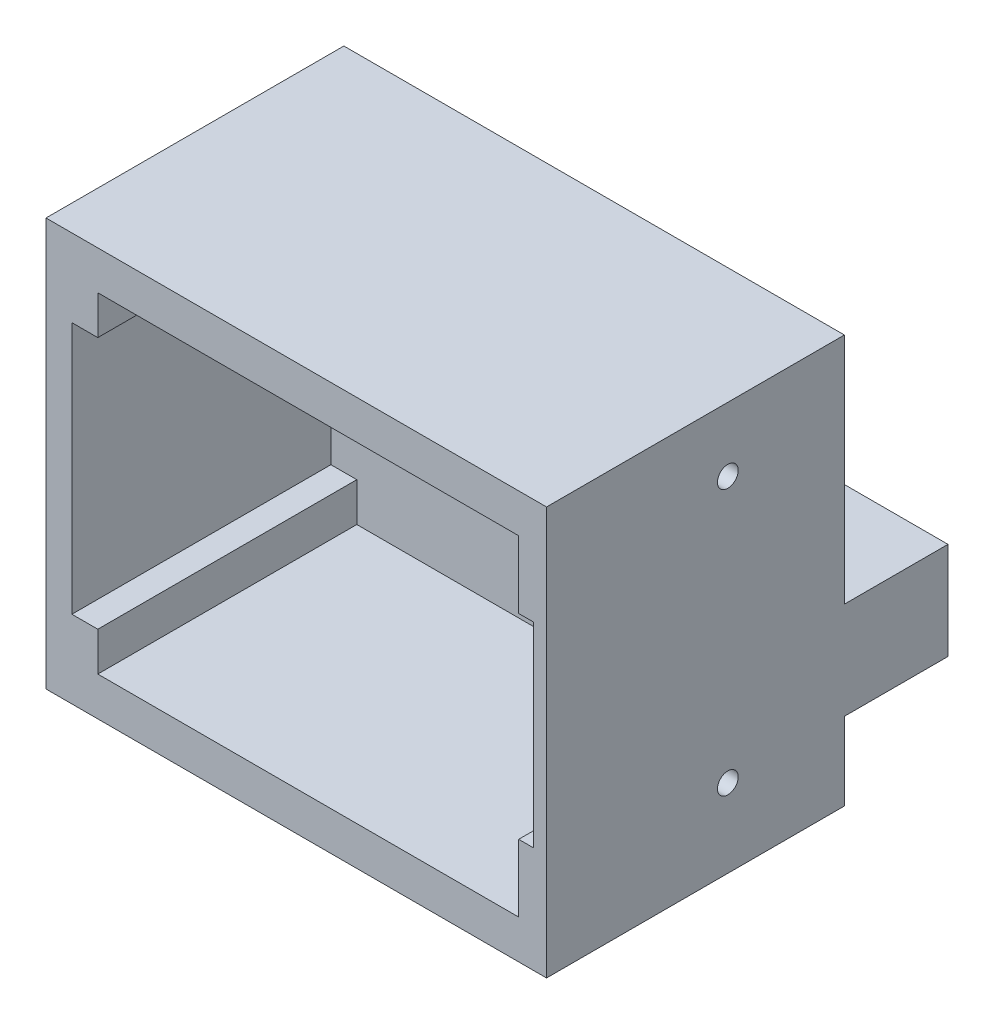
ISO-10303-21;
HEADER;
FILE_DESCRIPTION(('STEP AP214'),'2;1');
FILE_NAME('part.step','',(''),(''),'','','');
FILE_SCHEMA(('AUTOMOTIVE_DESIGN { 1 0 10303 214 1 1 1 1 }'));
ENDSEC;
DATA;
#1=APPLICATION_CONTEXT('core data for automotive mechanical design processes');
#2=APPLICATION_PROTOCOL_DEFINITION('international standard','automotive_design',2000,#1);
#3=PRODUCT_CONTEXT('',#1,'mechanical');
#4=PRODUCT('Part','Part','',(#3));
#5=PRODUCT_RELATED_PRODUCT_CATEGORY('part','',(#4));
#6=PRODUCT_DEFINITION_FORMATION('','',#4);
#7=PRODUCT_DEFINITION_CONTEXT('part definition',#1,'design');
#8=PRODUCT_DEFINITION('design','',#6,#7);
#9=PRODUCT_DEFINITION_SHAPE('','',#8);
#10=(LENGTH_UNIT() NAMED_UNIT(*) SI_UNIT(.MILLI.,.METRE.));
#11=(NAMED_UNIT(*) PLANE_ANGLE_UNIT() SI_UNIT($,.RADIAN.));
#12=(NAMED_UNIT(*) SI_UNIT($,.STERADIAN.) SOLID_ANGLE_UNIT());
#13=UNCERTAINTY_MEASURE_WITH_UNIT(LENGTH_MEASURE(1.E-05),#10,'distance_accuracy_value','');
#14=(GEOMETRIC_REPRESENTATION_CONTEXT(3) GLOBAL_UNCERTAINTY_ASSIGNED_CONTEXT((#13)) GLOBAL_UNIT_ASSIGNED_CONTEXT((#10,
#11,#12)) REPRESENTATION_CONTEXT('',''));
#15=CARTESIAN_POINT('',(0.,0.,0.));
#16=DIRECTION('',(0.,0.,1.));
#17=DIRECTION('',(1.,0.,0.));
#18=AXIS2_PLACEMENT_3D('',#15,#16,#17);
#19=CARTESIAN_POINT('',(0.,31.5,-23.));
#20=DIRECTION('',(0.,0.,1.));
#21=DIRECTION('',(1.,0.,0.));
#22=AXIS2_PLACEMENT_3D('',#19,#20,#21);
#23=PLANE('',#22);
#24=DIRECTION('',(1.,0.,0.));
#25=VECTOR('',#24,1.);
#26=CARTESIAN_POINT('',(0.,13.5,-23.));
#27=LINE('',#26,#25);
#28=CARTESIAN_POINT('',(0.,13.5,-23.));
#29=VERTEX_POINT('',#28);
#30=CARTESIAN_POINT('',(38.65,13.5,-23.));
#31=VERTEX_POINT('',#30);
#32=EDGE_CURVE('E187',#29,#31,#27,.T.);
#33=ORIENTED_EDGE('',*,*,#32,.F.);
#34=DIRECTION('',(0.,-1.,0.));
#35=VECTOR('',#34,1.);
#36=CARTESIAN_POINT('',(0.,31.5,-23.));
#37=LINE('',#36,#35);
#38=CARTESIAN_POINT('',(0.,31.5,-23.));
#39=VERTEX_POINT('',#38);
#40=EDGE_CURVE('E353',#39,#29,#37,.T.);
#41=ORIENTED_EDGE('',*,*,#40,.F.);
#42=DIRECTION('',(-1.,0.,0.));
#43=VECTOR('',#42,1.);
#44=CARTESIAN_POINT('',(0.,31.5,-23.));
#45=LINE('',#44,#43);
#46=CARTESIAN_POINT('',(38.65,31.5,-23.));
#47=VERTEX_POINT('',#46);
#48=EDGE_CURVE('E344',#47,#39,#45,.T.);
#49=ORIENTED_EDGE('',*,*,#48,.F.);
#50=DIRECTION('',(0.,-1.,0.));
#51=VECTOR('',#50,1.);
#52=CARTESIAN_POINT('',(38.65,31.5,-23.));
#53=LINE('',#52,#51);
#54=EDGE_CURVE('E357',#47,#31,#53,.T.);
#55=ORIENTED_EDGE('',*,*,#54,.T.);
#56=EDGE_LOOP('',(#33,#41,#49,#55));
#57=FACE_BOUND('',#56,.T.);
#58=ADVANCED_FACE('F44',(#57),#23,.F.);
#59=CARTESIAN_POINT('',(0.,31.5,0.));
#60=DIRECTION('',(1.,0.,0.));
#61=DIRECTION('',(0.,0.,-1.));
#62=AXIS2_PLACEMENT_3D('',#59,#60,#61);
#63=PLANE('',#62);
#64=DIRECTION('',(0.,0.,1.));
#65=VECTOR('',#64,1.);
#66=CARTESIAN_POINT('',(0.,0.,0.));
#67=LINE('',#66,#65);
#68=CARTESIAN_POINT('',(0.,0.,-23.));
#69=VERTEX_POINT('',#68);
#70=CARTESIAN_POINT('',(0.,0.,0.));
#71=VERTEX_POINT('',#70);
#72=EDGE_CURVE('E313',#69,#71,#67,.T.);
#73=ORIENTED_EDGE('',*,*,#72,.T.);
#74=DIRECTION('',(0.,-1.,0.));
#75=VECTOR('',#74,1.);
#76=CARTESIAN_POINT('',(0.,31.5,0.));
#77=LINE('',#76,#75);
#78=CARTESIAN_POINT('',(0.,31.5,0.));
#79=VERTEX_POINT('',#78);
#80=EDGE_CURVE('E11',#79,#71,#77,.T.);
#81=ORIENTED_EDGE('',*,*,#80,.F.);
#82=DIRECTION('',(0.,0.,1.));
#83=VECTOR('',#82,1.);
#84=CARTESIAN_POINT('',(0.,31.5,0.));
#85=LINE('',#84,#83);
#86=EDGE_CURVE('E336',#39,#79,#85,.T.);
#87=ORIENTED_EDGE('',*,*,#86,.F.);
#88=ORIENTED_EDGE('',*,*,#40,.T.);
#89=DIRECTION('',(0.,0.,-1.));
#90=VECTOR('',#89,1.);
#91=CARTESIAN_POINT('',(0.,13.5,0.));
#92=LINE('',#91,#90);
#93=CARTESIAN_POINT('',(0.,13.5,-31.));
#94=VERTEX_POINT('',#93);
#95=EDGE_CURVE('E201',#29,#94,#92,.T.);
#96=ORIENTED_EDGE('',*,*,#95,.T.);
#97=DIRECTION('',(0.,-1.,0.));
#98=VECTOR('',#97,1.);
#99=CARTESIAN_POINT('',(0.,13.5,-31.));
#100=LINE('',#99,#98);
#101=CARTESIAN_POINT('',(0.,6.,-31.));
#102=VERTEX_POINT('',#101);
#103=EDGE_CURVE('E200',#94,#102,#100,.T.);
#104=ORIENTED_EDGE('',*,*,#103,.T.);
#105=DIRECTION('',(0.,0.,-1.));
#106=VECTOR('',#105,1.);
#107=CARTESIAN_POINT('',(0.,6.,0.));
#108=LINE('',#107,#106);
#109=CARTESIAN_POINT('',(0.,6.,-23.));
#110=VERTEX_POINT('',#109);
#111=EDGE_CURVE('E223',#110,#102,#108,.T.);
#112=ORIENTED_EDGE('',*,*,#111,.F.);
#113=EDGE_CURVE('E64',#110,#69,#37,.T.);
#114=ORIENTED_EDGE('',*,*,#113,.T.);
#115=EDGE_LOOP('',(#73,#81,#87,#88,#96,#104,#112,#114));
#116=FACE_BOUND('',#115,.T.);
#117=ADVANCED_FACE('F46',(#116),#63,.F.);
#118=CARTESIAN_POINT('',(0.,31.5,0.));
#119=DIRECTION('',(0.,0.,-1.));
#120=DIRECTION('',(-1.,0.,0.));
#121=AXIS2_PLACEMENT_3D('',#118,#119,#120);
#122=PLANE('',#121);
#123=DIRECTION('',(-1.,0.,0.));
#124=VECTOR('',#123,1.);
#125=CARTESIAN_POINT('',(4.,25.5,0.));
#126=LINE('',#125,#124);
#127=CARTESIAN_POINT('',(4.,25.5,0.));
#128=VERTEX_POINT('',#127);
#129=CARTESIAN_POINT('',(2.,25.5,0.));
#130=VERTEX_POINT('',#129);
#131=EDGE_CURVE('E279',#128,#130,#126,.T.);
#132=ORIENTED_EDGE('',*,*,#131,.F.);
#133=DIRECTION('',(0.,-1.,0.));
#134=VECTOR('',#133,1.);
#135=CARTESIAN_POINT('',(4.,28.5,0.));
#136=LINE('',#135,#134);
#137=CARTESIAN_POINT('',(4.,28.5,0.));
#138=VERTEX_POINT('',#137);
#139=EDGE_CURVE('E235',#138,#128,#136,.T.);
#140=ORIENTED_EDGE('',*,*,#139,.F.);
#141=DIRECTION('',(-1.,0.,0.));
#142=VECTOR('',#141,1.);
#143=CARTESIAN_POINT('',(36.5,28.5,0.));
#144=LINE('',#143,#142);
#145=CARTESIAN_POINT('',(36.5,28.5,0.));
#146=VERTEX_POINT('',#145);
#147=EDGE_CURVE('E244',#146,#138,#144,.T.);
#148=ORIENTED_EDGE('',*,*,#147,.F.);
#149=DIRECTION('',(0.,1.,0.));
#150=VECTOR('',#149,1.);
#151=CARTESIAN_POINT('',(36.5,23.3,0.));
#152=LINE('',#151,#150);
#153=CARTESIAN_POINT('',(36.5,23.3,0.));
#154=VERTEX_POINT('',#153);
#155=EDGE_CURVE('E306',#154,#146,#152,.T.);
#156=ORIENTED_EDGE('',*,*,#155,.F.);
#157=DIRECTION('',(-1.,0.,0.));
#158=VECTOR('',#157,1.);
#159=CARTESIAN_POINT('',(37.65,23.3,0.));
#160=LINE('',#159,#158);
#161=CARTESIAN_POINT('',(37.65,23.3,0.));
#162=VERTEX_POINT('',#161);
#163=EDGE_CURVE('E303',#162,#154,#160,.T.);
#164=ORIENTED_EDGE('',*,*,#163,.F.);
#165=DIRECTION('',(0.,1.,0.));
#166=VECTOR('',#165,1.);
#167=CARTESIAN_POINT('',(37.65,8.2,0.));
#168=LINE('',#167,#166);
#169=CARTESIAN_POINT('',(37.65,8.2,0.));
#170=VERTEX_POINT('',#169);
#171=EDGE_CURVE('E300',#170,#162,#168,.T.);
#172=ORIENTED_EDGE('',*,*,#171,.F.);
#173=DIRECTION('',(1.,0.,0.));
#174=VECTOR('',#173,1.);
#175=CARTESIAN_POINT('',(36.5,8.2,0.));
#176=LINE('',#175,#174);
#177=CARTESIAN_POINT('',(36.5,8.2,0.));
#178=VERTEX_POINT('',#177);
#179=EDGE_CURVE('E297',#178,#170,#176,.T.);
#180=ORIENTED_EDGE('',*,*,#179,.F.);
#181=DIRECTION('',(0.,1.,0.));
#182=VECTOR('',#181,1.);
#183=CARTESIAN_POINT('',(36.5,3.,0.));
#184=LINE('',#183,#182);
#185=CARTESIAN_POINT('',(36.5,3.,0.));
#186=VERTEX_POINT('',#185);
#187=EDGE_CURVE('E294',#186,#178,#184,.T.);
#188=ORIENTED_EDGE('',*,*,#187,.F.);
#189=DIRECTION('',(1.,0.,0.));
#190=VECTOR('',#189,1.);
#191=CARTESIAN_POINT('',(4.,3.,0.));
#192=LINE('',#191,#190);
#193=CARTESIAN_POINT('',(4.,3.,0.));
#194=VERTEX_POINT('',#193);
#195=EDGE_CURVE('E291',#194,#186,#192,.T.);
#196=ORIENTED_EDGE('',*,*,#195,.F.);
#197=DIRECTION('',(0.,-1.,0.));
#198=VECTOR('',#197,1.);
#199=CARTESIAN_POINT('',(4.,6.,0.));
#200=LINE('',#199,#198);
#201=CARTESIAN_POINT('',(4.,6.,0.));
#202=VERTEX_POINT('',#201);
#203=EDGE_CURVE('E288',#202,#194,#200,.T.);
#204=ORIENTED_EDGE('',*,*,#203,.F.);
#205=DIRECTION('',(1.,0.,0.));
#206=VECTOR('',#205,1.);
#207=CARTESIAN_POINT('',(2.,6.,0.));
#208=LINE('',#207,#206);
#209=CARTESIAN_POINT('',(2.,6.,0.));
#210=VERTEX_POINT('',#209);
#211=EDGE_CURVE('E285',#210,#202,#208,.T.);
#212=ORIENTED_EDGE('',*,*,#211,.F.);
#213=DIRECTION('',(0.,-1.,0.));
#214=VECTOR('',#213,1.);
#215=CARTESIAN_POINT('',(2.,25.5,0.));
#216=LINE('',#215,#214);
#217=EDGE_CURVE('E282',#130,#210,#216,.T.);
#218=ORIENTED_EDGE('',*,*,#217,.F.);
#219=EDGE_LOOP('',(#132,#140,#148,#156,#164,#172,#180,#188,#196,#204,#212,#218));
#220=FACE_BOUND('',#219,.T.);
#221=DIRECTION('',(1.,0.,0.));
#222=VECTOR('',#221,1.);
#223=CARTESIAN_POINT('',(0.,0.,0.));
#224=LINE('',#223,#222);
#225=CARTESIAN_POINT('',(38.65,0.,0.));
#226=VERTEX_POINT('',#225);
#227=EDGE_CURVE('E348',#71,#226,#224,.T.);
#228=ORIENTED_EDGE('',*,*,#227,.T.);
#229=DIRECTION('',(0.,-1.,0.));
#230=VECTOR('',#229,1.);
#231=CARTESIAN_POINT('',(38.65,31.5,0.));
#232=LINE('',#231,#230);
#233=CARTESIAN_POINT('',(38.65,31.5,0.));
#234=VERTEX_POINT('',#233);
#235=EDGE_CURVE('E52',#234,#226,#232,.T.);
#236=ORIENTED_EDGE('',*,*,#235,.F.);
#237=DIRECTION('',(1.,0.,0.));
#238=VECTOR('',#237,1.);
#239=CARTESIAN_POINT('',(0.,31.5,0.));
#240=LINE('',#239,#238);
#241=EDGE_CURVE('E339',#79,#234,#240,.T.);
#242=ORIENTED_EDGE('',*,*,#241,.F.);
#243=ORIENTED_EDGE('',*,*,#80,.T.);
#244=EDGE_LOOP('',(#228,#236,#242,#243));
#245=FACE_BOUND('',#244,.T.);
#246=ADVANCED_FACE('F379',(#220,#245),#122,.F.);
#247=CARTESIAN_POINT('',(38.65,31.5,0.));
#248=DIRECTION('',(-1.,0.,0.));
#249=DIRECTION('',(0.,0.,1.));
#250=AXIS2_PLACEMENT_3D('',#247,#248,#249);
#251=PLANE('',#250);
#252=CARTESIAN_POINT('',(38.65,26.55,-14.));
#253=DIRECTION('',(-1.,0.,0.));
#254=DIRECTION('',(0.,0.,1.));
#255=AXIS2_PLACEMENT_3D('',#252,#253,#254);
#256=CIRCLE('',#255,0.8);
#257=CARTESIAN_POINT('',(38.65,26.55,-13.2));
#258=VERTEX_POINT('',#257);
#259=EDGE_CURVE('E231',#258,#258,#256,.F.);
#260=ORIENTED_EDGE('',*,*,#259,.F.);
#261=EDGE_LOOP('',(#260));
#262=FACE_BOUND('',#261,.T.);
#263=CARTESIAN_POINT('',(38.65,6.05,-14.));
#264=DIRECTION('',(-1.,0.,0.));
#265=DIRECTION('',(0.,0.,1.));
#266=AXIS2_PLACEMENT_3D('',#263,#264,#265);
#267=CIRCLE('',#266,0.800000000000001);
#268=CARTESIAN_POINT('',(38.65,6.05,-13.2));
#269=VERTEX_POINT('',#268);
#270=EDGE_CURVE('E232',#269,#269,#267,.F.);
#271=ORIENTED_EDGE('',*,*,#270,.F.);
#272=EDGE_LOOP('',(#271));
#273=FACE_BOUND('',#272,.T.);
#274=DIRECTION('',(0.,0.,-1.));
#275=VECTOR('',#274,1.);
#276=CARTESIAN_POINT('',(38.65,0.,0.));
#277=LINE('',#276,#275);
#278=CARTESIAN_POINT('',(38.65,0.,-23.));
#279=VERTEX_POINT('',#278);
#280=EDGE_CURVE('E350',#226,#279,#277,.T.);
#281=ORIENTED_EDGE('',*,*,#280,.T.);
#282=CARTESIAN_POINT('',(38.65,6.,-23.));
#283=VERTEX_POINT('',#282);
#284=EDGE_CURVE('E356',#283,#279,#53,.T.);
#285=ORIENTED_EDGE('',*,*,#284,.F.);
#286=DIRECTION('',(0.,0.,-1.));
#287=VECTOR('',#286,1.);
#288=CARTESIAN_POINT('',(38.65,6.,0.));
#289=LINE('',#288,#287);
#290=CARTESIAN_POINT('',(38.65,6.,-31.));
#291=VERTEX_POINT('',#290);
#292=EDGE_CURVE('E196',#283,#291,#289,.T.);
#293=ORIENTED_EDGE('',*,*,#292,.T.);
#294=DIRECTION('',(0.,-1.,0.));
#295=VECTOR('',#294,1.);
#296=CARTESIAN_POINT('',(38.65,13.5,-31.));
#297=LINE('',#296,#295);
#298=CARTESIAN_POINT('',(38.65,13.5,-31.));
#299=VERTEX_POINT('',#298);
#300=EDGE_CURVE('E192',#299,#291,#297,.T.);
#301=ORIENTED_EDGE('',*,*,#300,.F.);
#302=DIRECTION('',(0.,0.,-1.));
#303=VECTOR('',#302,1.);
#304=CARTESIAN_POINT('',(38.65,13.5,0.));
#305=LINE('',#304,#303);
#306=EDGE_CURVE('E180',#31,#299,#305,.T.);
#307=ORIENTED_EDGE('',*,*,#306,.F.);
#308=ORIENTED_EDGE('',*,*,#54,.F.);
#309=DIRECTION('',(0.,0.,-1.));
#310=VECTOR('',#309,1.);
#311=CARTESIAN_POINT('',(38.65,31.5,0.));
#312=LINE('',#311,#310);
#313=EDGE_CURVE('E342',#234,#47,#312,.T.);
#314=ORIENTED_EDGE('',*,*,#313,.F.);
#315=ORIENTED_EDGE('',*,*,#235,.T.);
#316=EDGE_LOOP('',(#281,#285,#293,#301,#307,#308,#314,#315));
#317=FACE_BOUND('',#316,.T.);
#318=ADVANCED_FACE('F194',(#262,#273,#317),#251,.F.);
#319=ORIENTED_EDGE('',*,*,#113,.F.);
#320=DIRECTION('',(1.,0.,0.));
#321=VECTOR('',#320,1.);
#322=CARTESIAN_POINT('',(0.,6.,-23.));
#323=LINE('',#322,#321);
#324=EDGE_CURVE('E59',#110,#283,#323,.T.);
#325=ORIENTED_EDGE('',*,*,#324,.T.);
#326=ORIENTED_EDGE('',*,*,#284,.T.);
#327=DIRECTION('',(-1.,0.,0.));
#328=VECTOR('',#327,1.);
#329=CARTESIAN_POINT('',(0.,0.,-23.));
#330=LINE('',#329,#328);
#331=EDGE_CURVE('E340',#279,#69,#330,.T.);
#332=ORIENTED_EDGE('',*,*,#331,.T.);
#333=EDGE_LOOP('',(#319,#325,#326,#332));
#334=FACE_BOUND('',#333,.T.);
#335=ADVANCED_FACE('F367',(#334),#23,.F.);
#336=CARTESIAN_POINT('',(0.,31.5,0.));
#337=DIRECTION('',(0.,-1.,0.));
#338=DIRECTION('',(0.,0.,-1.));
#339=AXIS2_PLACEMENT_3D('',#336,#337,#338);
#340=PLANE('',#339);
#341=ORIENTED_EDGE('',*,*,#86,.T.);
#342=ORIENTED_EDGE('',*,*,#241,.T.);
#343=ORIENTED_EDGE('',*,*,#313,.T.);
#344=ORIENTED_EDGE('',*,*,#48,.T.);
#345=EDGE_LOOP('',(#341,#342,#343,#344));
#346=FACE_BOUND('',#345,.T.);
#347=ADVANCED_FACE('F378',(#346),#340,.F.);
#348=CARTESIAN_POINT('',(0.,0.,0.));
#349=DIRECTION('',(0.,-1.,0.));
#350=DIRECTION('',(0.,0.,-1.));
#351=AXIS2_PLACEMENT_3D('',#348,#349,#350);
#352=PLANE('',#351);
#353=ORIENTED_EDGE('',*,*,#72,.F.);
#354=ORIENTED_EDGE('',*,*,#331,.F.);
#355=ORIENTED_EDGE('',*,*,#280,.F.);
#356=ORIENTED_EDGE('',*,*,#227,.F.);
#357=EDGE_LOOP('',(#353,#354,#355,#356));
#358=FACE_BOUND('',#357,.T.);
#359=ADVANCED_FACE('F366',(#358),#352,.T.);
#360=CARTESIAN_POINT('',(4.,28.5,-20.));
#361=DIRECTION('',(-1.,0.,0.));
#362=DIRECTION('',(0.,-1.,0.));
#363=AXIS2_PLACEMENT_3D('',#360,#361,#362);
#364=PLANE('',#363);
#365=ORIENTED_EDGE('',*,*,#139,.T.);
#366=DIRECTION('',(0.,0.,1.));
#367=VECTOR('',#366,1.);
#368=CARTESIAN_POINT('',(4.,25.5,-20.));
#369=LINE('',#368,#367);
#370=CARTESIAN_POINT('',(4.,25.5,-20.));
#371=VERTEX_POINT('',#370);
#372=EDGE_CURVE('E277',#371,#128,#369,.T.);
#373=ORIENTED_EDGE('',*,*,#372,.F.);
#374=DIRECTION('',(0.,-1.,0.));
#375=VECTOR('',#374,1.);
#376=CARTESIAN_POINT('',(4.,28.5,-20.));
#377=LINE('',#376,#375);
#378=CARTESIAN_POINT('',(4.,28.5,-20.));
#379=VERTEX_POINT('',#378);
#380=EDGE_CURVE('E240',#379,#371,#377,.T.);
#381=ORIENTED_EDGE('',*,*,#380,.F.);
#382=DIRECTION('',(0.,0.,1.));
#383=VECTOR('',#382,1.);
#384=CARTESIAN_POINT('',(4.,28.5,-20.));
#385=LINE('',#384,#383);
#386=EDGE_CURVE('E311',#379,#138,#385,.T.);
#387=ORIENTED_EDGE('',*,*,#386,.T.);
#388=EDGE_LOOP('',(#365,#373,#381,#387));
#389=FACE_BOUND('',#388,.T.);
#390=ADVANCED_FACE('F402',(#389),#364,.F.);
#391=CARTESIAN_POINT('',(36.5,28.5,-20.));
#392=DIRECTION('',(0.,1.,0.));
#393=DIRECTION('',(-1.,0.,0.));
#394=AXIS2_PLACEMENT_3D('',#391,#392,#393);
#395=PLANE('',#394);
#396=ORIENTED_EDGE('',*,*,#147,.T.);
#397=ORIENTED_EDGE('',*,*,#386,.F.);
#398=DIRECTION('',(-1.,0.,0.));
#399=VECTOR('',#398,1.);
#400=CARTESIAN_POINT('',(36.5,28.5,-20.));
#401=LINE('',#400,#399);
#402=CARTESIAN_POINT('',(36.5,28.5,-20.));
#403=VERTEX_POINT('',#402);
#404=EDGE_CURVE('E274',#403,#379,#401,.T.);
#405=ORIENTED_EDGE('',*,*,#404,.F.);
#406=DIRECTION('',(0.,0.,1.));
#407=VECTOR('',#406,1.);
#408=CARTESIAN_POINT('',(36.5,28.5,-20.));
#409=LINE('',#408,#407);
#410=EDGE_CURVE('E314',#403,#146,#409,.T.);
#411=ORIENTED_EDGE('',*,*,#410,.T.);
#412=EDGE_LOOP('',(#396,#397,#405,#411));
#413=FACE_BOUND('',#412,.T.);
#414=ADVANCED_FACE('F406',(#413),#395,.F.);
#415=CARTESIAN_POINT('',(36.5,23.3,-20.));
#416=DIRECTION('',(1.,0.,0.));
#417=DIRECTION('',(0.,1.,0.));
#418=AXIS2_PLACEMENT_3D('',#415,#416,#417);
#419=PLANE('',#418);
#420=CARTESIAN_POINT('',(36.5,26.55,-14.));
#421=DIRECTION('',(-1.,0.,0.));
#422=DIRECTION('',(0.,0.,1.));
#423=AXIS2_PLACEMENT_3D('',#420,#421,#422);
#424=CIRCLE('',#423,0.8);
#425=CARTESIAN_POINT('',(36.5,26.55,-13.2));
#426=VERTEX_POINT('',#425);
#427=EDGE_CURVE('E228',#426,#426,#424,.T.);
#428=ORIENTED_EDGE('',*,*,#427,.F.);
#429=EDGE_LOOP('',(#428));
#430=FACE_BOUND('',#429,.T.);
#431=ORIENTED_EDGE('',*,*,#155,.T.);
#432=ORIENTED_EDGE('',*,*,#410,.F.);
#433=DIRECTION('',(0.,1.,0.));
#434=VECTOR('',#433,1.);
#435=CARTESIAN_POINT('',(36.5,23.3,-20.));
#436=LINE('',#435,#434);
#437=CARTESIAN_POINT('',(36.5,23.3,-20.));
#438=VERTEX_POINT('',#437);
#439=EDGE_CURVE('E271',#438,#403,#436,.T.);
#440=ORIENTED_EDGE('',*,*,#439,.F.);
#441=DIRECTION('',(0.,0.,1.));
#442=VECTOR('',#441,1.);
#443=CARTESIAN_POINT('',(36.5,23.3,-20.));
#444=LINE('',#443,#442);
#445=EDGE_CURVE('E316',#438,#154,#444,.T.);
#446=ORIENTED_EDGE('',*,*,#445,.T.);
#447=EDGE_LOOP('',(#431,#432,#440,#446));
#448=FACE_BOUND('',#447,.T.);
#449=ADVANCED_FACE('F444',(#430,#448),#419,.F.);
#450=CARTESIAN_POINT('',(37.65,23.3,-20.));
#451=DIRECTION('',(0.,1.,0.));
#452=DIRECTION('',(0.,0.,1.));
#453=AXIS2_PLACEMENT_3D('',#450,#451,#452);
#454=PLANE('',#453);
#455=ORIENTED_EDGE('',*,*,#163,.T.);
#456=ORIENTED_EDGE('',*,*,#445,.F.);
#457=DIRECTION('',(-1.,0.,0.));
#458=VECTOR('',#457,1.);
#459=CARTESIAN_POINT('',(37.65,23.3,-20.));
#460=LINE('',#459,#458);
#461=CARTESIAN_POINT('',(37.65,23.3,-20.));
#462=VERTEX_POINT('',#461);
#463=EDGE_CURVE('E268',#462,#438,#460,.T.);
#464=ORIENTED_EDGE('',*,*,#463,.F.);
#465=DIRECTION('',(0.,0.,1.));
#466=VECTOR('',#465,1.);
#467=CARTESIAN_POINT('',(37.65,23.3,-20.));
#468=LINE('',#467,#466);
#469=EDGE_CURVE('E318',#462,#162,#468,.T.);
#470=ORIENTED_EDGE('',*,*,#469,.T.);
#471=EDGE_LOOP('',(#455,#456,#464,#470));
#472=FACE_BOUND('',#471,.T.);
#473=ADVANCED_FACE('F440',(#472),#454,.F.);
#474=CARTESIAN_POINT('',(37.65,8.2,-20.));
#475=DIRECTION('',(1.,0.,0.));
#476=DIRECTION('',(0.,0.,-1.));
#477=AXIS2_PLACEMENT_3D('',#474,#475,#476);
#478=PLANE('',#477);
#479=ORIENTED_EDGE('',*,*,#171,.T.);
#480=ORIENTED_EDGE('',*,*,#469,.F.);
#481=DIRECTION('',(0.,1.,0.));
#482=VECTOR('',#481,1.);
#483=CARTESIAN_POINT('',(37.65,8.2,-20.));
#484=LINE('',#483,#482);
#485=CARTESIAN_POINT('',(37.65,8.2,-20.));
#486=VERTEX_POINT('',#485);
#487=EDGE_CURVE('E265',#486,#462,#484,.T.);
#488=ORIENTED_EDGE('',*,*,#487,.F.);
#489=DIRECTION('',(0.,0.,1.));
#490=VECTOR('',#489,1.);
#491=CARTESIAN_POINT('',(37.65,8.2,-20.));
#492=LINE('',#491,#490);
#493=EDGE_CURVE('E320',#486,#170,#492,.T.);
#494=ORIENTED_EDGE('',*,*,#493,.T.);
#495=EDGE_LOOP('',(#479,#480,#488,#494));
#496=FACE_BOUND('',#495,.T.);
#497=ADVANCED_FACE('F436',(#496),#478,.F.);
#498=CARTESIAN_POINT('',(36.5,8.2,-20.));
#499=DIRECTION('',(0.,-1.,0.));
#500=DIRECTION('',(0.,0.,-1.));
#501=AXIS2_PLACEMENT_3D('',#498,#499,#500);
#502=PLANE('',#501);
#503=ORIENTED_EDGE('',*,*,#179,.T.);
#504=ORIENTED_EDGE('',*,*,#493,.F.);
#505=DIRECTION('',(1.,0.,0.));
#506=VECTOR('',#505,1.);
#507=CARTESIAN_POINT('',(36.5,8.2,-20.));
#508=LINE('',#507,#506);
#509=CARTESIAN_POINT('',(36.5,8.2,-20.));
#510=VERTEX_POINT('',#509);
#511=EDGE_CURVE('E262',#510,#486,#508,.T.);
#512=ORIENTED_EDGE('',*,*,#511,.F.);
#513=DIRECTION('',(0.,0.,1.));
#514=VECTOR('',#513,1.);
#515=CARTESIAN_POINT('',(36.5,8.2,-20.));
#516=LINE('',#515,#514);
#517=EDGE_CURVE('E322',#510,#178,#516,.T.);
#518=ORIENTED_EDGE('',*,*,#517,.T.);
#519=EDGE_LOOP('',(#503,#504,#512,#518));
#520=FACE_BOUND('',#519,.T.);
#521=ADVANCED_FACE('F432',(#520),#502,.F.);
#522=CARTESIAN_POINT('',(36.5,3.,-20.));
#523=DIRECTION('',(1.,0.,0.));
#524=DIRECTION('',(0.,0.,-1.));
#525=AXIS2_PLACEMENT_3D('',#522,#523,#524);
#526=PLANE('',#525);
#527=CARTESIAN_POINT('',(36.5,6.05,-14.));
#528=DIRECTION('',(-1.,0.,0.));
#529=DIRECTION('',(0.,0.,1.));
#530=AXIS2_PLACEMENT_3D('',#527,#528,#529);
#531=CIRCLE('',#530,0.800000000000001);
#532=CARTESIAN_POINT('',(36.5,6.05,-13.2));
#533=VERTEX_POINT('',#532);
#534=EDGE_CURVE('E226',#533,#533,#531,.T.);
#535=ORIENTED_EDGE('',*,*,#534,.F.);
#536=EDGE_LOOP('',(#535));
#537=FACE_BOUND('',#536,.T.);
#538=ORIENTED_EDGE('',*,*,#187,.T.);
#539=ORIENTED_EDGE('',*,*,#517,.F.);
#540=DIRECTION('',(0.,1.,0.));
#541=VECTOR('',#540,1.);
#542=CARTESIAN_POINT('',(36.5,3.,-20.));
#543=LINE('',#542,#541);
#544=CARTESIAN_POINT('',(36.5,3.,-20.));
#545=VERTEX_POINT('',#544);
#546=EDGE_CURVE('E259',#545,#510,#543,.T.);
#547=ORIENTED_EDGE('',*,*,#546,.F.);
#548=DIRECTION('',(0.,0.,1.));
#549=VECTOR('',#548,1.);
#550=CARTESIAN_POINT('',(36.5,3.,-20.));
#551=LINE('',#550,#549);
#552=EDGE_CURVE('E324',#545,#186,#551,.T.);
#553=ORIENTED_EDGE('',*,*,#552,.T.);
#554=EDGE_LOOP('',(#538,#539,#547,#553));
#555=FACE_BOUND('',#554,.T.);
#556=ADVANCED_FACE('F428',(#537,#555),#526,.F.);
#557=CARTESIAN_POINT('',(4.,3.,-20.));
#558=DIRECTION('',(0.,-1.,0.));
#559=DIRECTION('',(0.,0.,-1.));
#560=AXIS2_PLACEMENT_3D('',#557,#558,#559);
#561=PLANE('',#560);
#562=ORIENTED_EDGE('',*,*,#195,.T.);
#563=ORIENTED_EDGE('',*,*,#552,.F.);
#564=DIRECTION('',(1.,0.,0.));
#565=VECTOR('',#564,1.);
#566=CARTESIAN_POINT('',(4.,3.,-20.));
#567=LINE('',#566,#565);
#568=CARTESIAN_POINT('',(4.,3.,-20.));
#569=VERTEX_POINT('',#568);
#570=EDGE_CURVE('E256',#569,#545,#567,.T.);
#571=ORIENTED_EDGE('',*,*,#570,.F.);
#572=DIRECTION('',(0.,0.,1.));
#573=VECTOR('',#572,1.);
#574=CARTESIAN_POINT('',(4.,3.,-20.));
#575=LINE('',#574,#573);
#576=EDGE_CURVE('E326',#569,#194,#575,.T.);
#577=ORIENTED_EDGE('',*,*,#576,.T.);
#578=EDGE_LOOP('',(#562,#563,#571,#577));
#579=FACE_BOUND('',#578,.T.);
#580=ADVANCED_FACE('F424',(#579),#561,.F.);
#581=CARTESIAN_POINT('',(4.,6.,-20.));
#582=DIRECTION('',(-1.,0.,0.));
#583=DIRECTION('',(0.,0.,1.));
#584=AXIS2_PLACEMENT_3D('',#581,#582,#583);
#585=PLANE('',#584);
#586=ORIENTED_EDGE('',*,*,#203,.T.);
#587=ORIENTED_EDGE('',*,*,#576,.F.);
#588=DIRECTION('',(0.,-1.,0.));
#589=VECTOR('',#588,1.);
#590=CARTESIAN_POINT('',(4.,6.,-20.));
#591=LINE('',#590,#589);
#592=CARTESIAN_POINT('',(4.,6.,-20.));
#593=VERTEX_POINT('',#592);
#594=EDGE_CURVE('E253',#593,#569,#591,.T.);
#595=ORIENTED_EDGE('',*,*,#594,.F.);
#596=DIRECTION('',(0.,0.,1.));
#597=VECTOR('',#596,1.);
#598=CARTESIAN_POINT('',(4.,6.,-20.));
#599=LINE('',#598,#597);
#600=EDGE_CURVE('E328',#593,#202,#599,.T.);
#601=ORIENTED_EDGE('',*,*,#600,.T.);
#602=EDGE_LOOP('',(#586,#587,#595,#601));
#603=FACE_BOUND('',#602,.T.);
#604=ADVANCED_FACE('F420',(#603),#585,.F.);
#605=CARTESIAN_POINT('',(2.,6.,-20.));
#606=DIRECTION('',(0.,-1.,0.));
#607=DIRECTION('',(0.,0.,-1.));
#608=AXIS2_PLACEMENT_3D('',#605,#606,#607);
#609=PLANE('',#608);
#610=ORIENTED_EDGE('',*,*,#211,.T.);
#611=ORIENTED_EDGE('',*,*,#600,.F.);
#612=DIRECTION('',(1.,0.,0.));
#613=VECTOR('',#612,1.);
#614=CARTESIAN_POINT('',(2.,6.,-20.));
#615=LINE('',#614,#613);
#616=CARTESIAN_POINT('',(2.,6.,-20.));
#617=VERTEX_POINT('',#616);
#618=EDGE_CURVE('E250',#617,#593,#615,.T.);
#619=ORIENTED_EDGE('',*,*,#618,.F.);
#620=DIRECTION('',(0.,0.,1.));
#621=VECTOR('',#620,1.);
#622=CARTESIAN_POINT('',(2.,6.,-20.));
#623=LINE('',#622,#621);
#624=EDGE_CURVE('E330',#617,#210,#623,.T.);
#625=ORIENTED_EDGE('',*,*,#624,.T.);
#626=EDGE_LOOP('',(#610,#611,#619,#625));
#627=FACE_BOUND('',#626,.T.);
#628=ADVANCED_FACE('F416',(#627),#609,.F.);
#629=CARTESIAN_POINT('',(2.,25.5,-20.));
#630=DIRECTION('',(-1.,0.,0.));
#631=DIRECTION('',(0.,-1.,0.));
#632=AXIS2_PLACEMENT_3D('',#629,#630,#631);
#633=PLANE('',#632);
#634=ORIENTED_EDGE('',*,*,#217,.T.);
#635=ORIENTED_EDGE('',*,*,#624,.F.);
#636=DIRECTION('',(0.,-1.,0.));
#637=VECTOR('',#636,1.);
#638=CARTESIAN_POINT('',(2.,25.5,-20.));
#639=LINE('',#638,#637);
#640=CARTESIAN_POINT('',(2.,25.5,-20.));
#641=VERTEX_POINT('',#640);
#642=EDGE_CURVE('E247',#641,#617,#639,.T.);
#643=ORIENTED_EDGE('',*,*,#642,.F.);
#644=DIRECTION('',(0.,0.,1.));
#645=VECTOR('',#644,1.);
#646=CARTESIAN_POINT('',(2.,25.5,-20.));
#647=LINE('',#646,#645);
#648=EDGE_CURVE('E332',#641,#130,#647,.T.);
#649=ORIENTED_EDGE('',*,*,#648,.T.);
#650=EDGE_LOOP('',(#634,#635,#643,#649));
#651=FACE_BOUND('',#650,.T.);
#652=ADVANCED_FACE('F412',(#651),#633,.F.);
#653=CARTESIAN_POINT('',(4.,25.5,-20.));
#654=DIRECTION('',(0.,1.,0.));
#655=DIRECTION('',(0.,0.,1.));
#656=AXIS2_PLACEMENT_3D('',#653,#654,#655);
#657=PLANE('',#656);
#658=ORIENTED_EDGE('',*,*,#131,.T.);
#659=ORIENTED_EDGE('',*,*,#648,.F.);
#660=DIRECTION('',(-1.,0.,0.));
#661=VECTOR('',#660,1.);
#662=CARTESIAN_POINT('',(4.,25.5,-20.));
#663=LINE('',#662,#661);
#664=EDGE_CURVE('E243',#371,#641,#663,.T.);
#665=ORIENTED_EDGE('',*,*,#664,.F.);
#666=ORIENTED_EDGE('',*,*,#372,.T.);
#667=EDGE_LOOP('',(#658,#659,#665,#666));
#668=FACE_BOUND('',#667,.T.);
#669=ADVANCED_FACE('F408',(#668),#657,.F.);
#670=CARTESIAN_POINT('',(0.,0.,-20.));
#671=DIRECTION('',(0.,0.,-1.));
#672=DIRECTION('',(-1.,0.,0.));
#673=AXIS2_PLACEMENT_3D('',#670,#671,#672);
#674=PLANE('',#673);
#675=ORIENTED_EDGE('',*,*,#380,.T.);
#676=ORIENTED_EDGE('',*,*,#664,.T.);
#677=ORIENTED_EDGE('',*,*,#642,.T.);
#678=ORIENTED_EDGE('',*,*,#618,.T.);
#679=ORIENTED_EDGE('',*,*,#594,.T.);
#680=ORIENTED_EDGE('',*,*,#570,.T.);
#681=ORIENTED_EDGE('',*,*,#546,.T.);
#682=ORIENTED_EDGE('',*,*,#511,.T.);
#683=ORIENTED_EDGE('',*,*,#487,.T.);
#684=ORIENTED_EDGE('',*,*,#463,.T.);
#685=ORIENTED_EDGE('',*,*,#439,.T.);
#686=ORIENTED_EDGE('',*,*,#404,.T.);
#687=EDGE_LOOP('',(#675,#676,#677,#678,#679,#680,#681,#682,#683,#684,#685,#686));
#688=FACE_BOUND('',#687,.T.);
#689=ADVANCED_FACE('F411',(#688),#674,.F.);
#690=CARTESIAN_POINT('',(40.912741699797,6.05,-14.));
#691=DIRECTION('',(-1.,0.,0.));
#692=DIRECTION('',(0.,0.,1.));
#693=AXIS2_PLACEMENT_3D('',#690,#691,#692);
#694=CYLINDRICAL_SURFACE('',#693,0.800000000000001);
#695=ORIENTED_EDGE('',*,*,#270,.T.);
#696=EDGE_LOOP('',(#695));
#697=FACE_BOUND('',#696,.T.);
#698=ORIENTED_EDGE('',*,*,#534,.T.);
#699=EDGE_LOOP('',(#698));
#700=FACE_BOUND('',#699,.T.);
#701=ADVANCED_FACE('F454',(#697,#700),#694,.F.);
#702=CARTESIAN_POINT('',(40.912741699797,26.55,-14.));
#703=DIRECTION('',(-1.,0.,0.));
#704=DIRECTION('',(0.,0.,1.));
#705=AXIS2_PLACEMENT_3D('',#702,#703,#704);
#706=CYLINDRICAL_SURFACE('',#705,0.8);
#707=ORIENTED_EDGE('',*,*,#259,.T.);
#708=EDGE_LOOP('',(#707));
#709=FACE_BOUND('',#708,.T.);
#710=ORIENTED_EDGE('',*,*,#427,.T.);
#711=EDGE_LOOP('',(#710));
#712=FACE_BOUND('',#711,.T.);
#713=ADVANCED_FACE('F458',(#709,#712),#706,.F.);
#714=CARTESIAN_POINT('',(0.,13.5,-31.));
#715=DIRECTION('',(0.,0.,-1.));
#716=DIRECTION('',(-1.,0.,0.));
#717=AXIS2_PLACEMENT_3D('',#714,#715,#716);
#718=PLANE('',#717);
#719=DIRECTION('',(1.,0.,0.));
#720=VECTOR('',#719,1.);
#721=CARTESIAN_POINT('',(0.,6.,-31.));
#722=LINE('',#721,#720);
#723=EDGE_CURVE('E219',#102,#291,#722,.T.);
#724=ORIENTED_EDGE('',*,*,#723,.F.);
#725=ORIENTED_EDGE('',*,*,#103,.F.);
#726=DIRECTION('',(1.,0.,0.));
#727=VECTOR('',#726,1.);
#728=CARTESIAN_POINT('',(0.,13.5,-31.));
#729=LINE('',#728,#727);
#730=EDGE_CURVE('E185',#94,#299,#729,.T.);
#731=ORIENTED_EDGE('',*,*,#730,.T.);
#732=ORIENTED_EDGE('',*,*,#300,.T.);
#733=EDGE_LOOP('',(#724,#725,#731,#732));
#734=FACE_BOUND('',#733,.T.);
#735=ADVANCED_FACE('F203',(#734),#718,.T.);
#736=CARTESIAN_POINT('',(29.65,13.5,-27.));
#737=DIRECTION('',(0.,-1.,0.));
#738=DIRECTION('',(0.,0.,-1.));
#739=AXIS2_PLACEMENT_3D('',#736,#737,#738);
#740=CYLINDRICAL_SURFACE('',#739,1.5);
#741=CARTESIAN_POINT('',(29.65,13.5,-27.));
#742=DIRECTION('',(0.,-1.,0.));
#743=DIRECTION('',(0.,0.,-1.));
#744=AXIS2_PLACEMENT_3D('',#741,#742,#743);
#745=CIRCLE('',#744,1.5);
#746=CARTESIAN_POINT('',(29.65,13.5,-28.5));
#747=VERTEX_POINT('',#746);
#748=EDGE_CURVE('E204',#747,#747,#745,.T.);
#749=ORIENTED_EDGE('',*,*,#748,.F.);
#750=EDGE_LOOP('',(#749));
#751=FACE_BOUND('',#750,.T.);
#752=CARTESIAN_POINT('',(29.65,6.,-27.));
#753=DIRECTION('',(0.,-1.,0.));
#754=DIRECTION('',(0.,0.,-1.));
#755=AXIS2_PLACEMENT_3D('',#752,#753,#754);
#756=CIRCLE('',#755,1.5);
#757=CARTESIAN_POINT('',(29.65,6.,-28.5));
#758=VERTEX_POINT('',#757);
#759=EDGE_CURVE('E216',#758,#758,#756,.T.);
#760=ORIENTED_EDGE('',*,*,#759,.T.);
#761=EDGE_LOOP('',(#760));
#762=FACE_BOUND('',#761,.T.);
#763=ADVANCED_FACE('F466',(#751,#762),#740,.F.);
#764=CARTESIAN_POINT('',(8.,13.5,-27.));
#765=DIRECTION('',(0.,-1.,0.));
#766=DIRECTION('',(0.,0.,-1.));
#767=AXIS2_PLACEMENT_3D('',#764,#765,#766);
#768=CYLINDRICAL_SURFACE('',#767,1.5);
#769=CARTESIAN_POINT('',(8.,13.5,-27.));
#770=DIRECTION('',(0.,-1.,0.));
#771=DIRECTION('',(0.,0.,-1.));
#772=AXIS2_PLACEMENT_3D('',#769,#770,#771);
#773=CIRCLE('',#772,1.5);
#774=CARTESIAN_POINT('',(8.,13.5,-28.5));
#775=VERTEX_POINT('',#774);
#776=EDGE_CURVE('E207',#775,#775,#773,.T.);
#777=ORIENTED_EDGE('',*,*,#776,.F.);
#778=EDGE_LOOP('',(#777));
#779=FACE_BOUND('',#778,.T.);
#780=CARTESIAN_POINT('',(8.,6.,-27.));
#781=DIRECTION('',(0.,-1.,0.));
#782=DIRECTION('',(0.,0.,-1.));
#783=AXIS2_PLACEMENT_3D('',#780,#781,#782);
#784=CIRCLE('',#783,1.5);
#785=CARTESIAN_POINT('',(8.,6.,-28.5));
#786=VERTEX_POINT('',#785);
#787=EDGE_CURVE('E213',#786,#786,#784,.T.);
#788=ORIENTED_EDGE('',*,*,#787,.T.);
#789=EDGE_LOOP('',(#788));
#790=FACE_BOUND('',#789,.T.);
#791=ADVANCED_FACE('F463',(#779,#790),#768,.F.);
#792=CARTESIAN_POINT('',(0.,13.5,0.));
#793=DIRECTION('',(0.,-1.,0.));
#794=DIRECTION('',(0.,0.,-1.));
#795=AXIS2_PLACEMENT_3D('',#792,#793,#794);
#796=PLANE('',#795);
#797=ORIENTED_EDGE('',*,*,#776,.T.);
#798=EDGE_LOOP('',(#797));
#799=FACE_BOUND('',#798,.T.);
#800=ORIENTED_EDGE('',*,*,#748,.T.);
#801=EDGE_LOOP('',(#800));
#802=FACE_BOUND('',#801,.T.);
#803=ORIENTED_EDGE('',*,*,#730,.F.);
#804=ORIENTED_EDGE('',*,*,#95,.F.);
#805=ORIENTED_EDGE('',*,*,#32,.T.);
#806=ORIENTED_EDGE('',*,*,#306,.T.);
#807=EDGE_LOOP('',(#803,#804,#805,#806));
#808=FACE_BOUND('',#807,.T.);
#809=ADVANCED_FACE('F182',(#799,#802,#808),#796,.F.);
#810=CARTESIAN_POINT('',(0.,6.,0.));
#811=DIRECTION('',(0.,-1.,0.));
#812=DIRECTION('',(0.,0.,-1.));
#813=AXIS2_PLACEMENT_3D('',#810,#811,#812);
#814=PLANE('',#813);
#815=ORIENTED_EDGE('',*,*,#787,.F.);
#816=EDGE_LOOP('',(#815));
#817=FACE_BOUND('',#816,.T.);
#818=ORIENTED_EDGE('',*,*,#759,.F.);
#819=EDGE_LOOP('',(#818));
#820=FACE_BOUND('',#819,.T.);
#821=ORIENTED_EDGE('',*,*,#723,.T.);
#822=ORIENTED_EDGE('',*,*,#292,.F.);
#823=ORIENTED_EDGE('',*,*,#324,.F.);
#824=ORIENTED_EDGE('',*,*,#111,.T.);
#825=EDGE_LOOP('',(#821,#822,#823,#824));
#826=FACE_BOUND('',#825,.T.);
#827=ADVANCED_FACE('F369',(#817,#820,#826),#814,.T.);
#828=CLOSED_SHELL('',(#58,#117,#246,#318,#335,#347,#359,#390,#414,#449,#473,#497,#521,#556,#580,
#604,#628,#652,#669,#689,#701,#713,#735,#763,#791,#809,#827));
#829=MANIFOLD_SOLID_BREP('B2',#828);
#830=ADVANCED_BREP_SHAPE_REPRESENTATION('',(#18,#829),#14);
#831=SHAPE_DEFINITION_REPRESENTATION(#9,#830);
ENDSEC;
END-ISO-10303-21;
